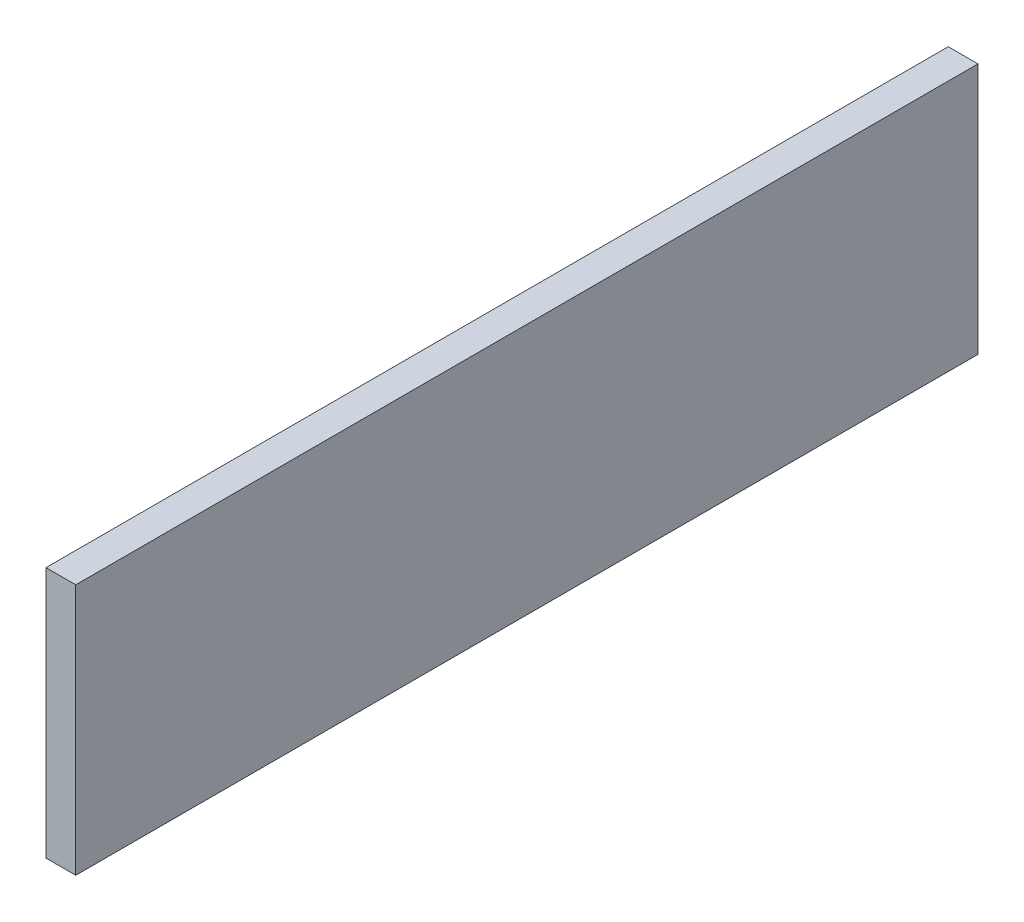
ISO-10303-21;
HEADER;
FILE_DESCRIPTION(('STEP AP214'),'2;1');
FILE_NAME('part.step','',(''),(''),'','','');
FILE_SCHEMA(('AUTOMOTIVE_DESIGN { 1 0 10303 214 1 1 1 1 }'));
ENDSEC;
DATA;
#1=APPLICATION_CONTEXT('core data for automotive mechanical design processes');
#2=APPLICATION_PROTOCOL_DEFINITION('international standard','automotive_design',2000,#1);
#3=PRODUCT_CONTEXT('',#1,'mechanical');
#4=PRODUCT('Part','Part','',(#3));
#5=PRODUCT_RELATED_PRODUCT_CATEGORY('part','',(#4));
#6=PRODUCT_DEFINITION_FORMATION('','',#4);
#7=PRODUCT_DEFINITION_CONTEXT('part definition',#1,'design');
#8=PRODUCT_DEFINITION('design','',#6,#7);
#9=PRODUCT_DEFINITION_SHAPE('','',#8);
#10=(LENGTH_UNIT() NAMED_UNIT(*) SI_UNIT(.MILLI.,.METRE.));
#11=(NAMED_UNIT(*) PLANE_ANGLE_UNIT() SI_UNIT($,.RADIAN.));
#12=(NAMED_UNIT(*) SI_UNIT($,.STERADIAN.) SOLID_ANGLE_UNIT());
#13=UNCERTAINTY_MEASURE_WITH_UNIT(LENGTH_MEASURE(1.E-05),#10,'distance_accuracy_value','');
#14=(GEOMETRIC_REPRESENTATION_CONTEXT(3) GLOBAL_UNCERTAINTY_ASSIGNED_CONTEXT((#13)) GLOBAL_UNIT_ASSIGNED_CONTEXT((#10,
#11,#12)) REPRESENTATION_CONTEXT('',''));
#15=CARTESIAN_POINT('',(0.,0.,0.));
#16=DIRECTION('',(0.,0.,1.));
#17=DIRECTION('',(1.,0.,0.));
#18=AXIS2_PLACEMENT_3D('',#15,#16,#17);
#19=CARTESIAN_POINT('',(0.,644.525,0.));
#20=DIRECTION('',(1.,0.,0.));
#21=DIRECTION('',(0.,0.,-1.));
#22=AXIS2_PLACEMENT_3D('',#19,#20,#21);
#23=PLANE('',#22);
#24=DIRECTION('',(0.,0.,1.));
#25=VECTOR('',#24,1.);
#26=CARTESIAN_POINT('',(0.,0.,0.));
#27=LINE('',#26,#25);
#28=CARTESIAN_POINT('',(0.,0.,-2311.4));
#29=VERTEX_POINT('',#28);
#30=CARTESIAN_POINT('',(0.,0.,0.));
#31=VERTEX_POINT('',#30);
#32=EDGE_CURVE('E97',#29,#31,#27,.T.);
#33=ORIENTED_EDGE('',*,*,#32,.T.);
#34=DIRECTION('',(0.,-1.,0.));
#35=VECTOR('',#34,1.);
#36=CARTESIAN_POINT('',(0.,644.525,0.));
#37=LINE('',#36,#35);
#38=CARTESIAN_POINT('',(0.,644.525,0.));
#39=VERTEX_POINT('',#38);
#40=EDGE_CURVE('E11',#39,#31,#37,.T.);
#41=ORIENTED_EDGE('',*,*,#40,.F.);
#42=DIRECTION('',(0.,0.,1.));
#43=VECTOR('',#42,1.);
#44=CARTESIAN_POINT('',(0.,644.525,0.));
#45=LINE('',#44,#43);
#46=CARTESIAN_POINT('',(0.,644.525,-2311.4));
#47=VERTEX_POINT('',#46);
#48=EDGE_CURVE('E85',#47,#39,#45,.T.);
#49=ORIENTED_EDGE('',*,*,#48,.F.);
#50=DIRECTION('',(0.,-1.,0.));
#51=VECTOR('',#50,1.);
#52=CARTESIAN_POINT('',(0.,644.525,-2311.4));
#53=LINE('',#52,#51);
#54=EDGE_CURVE('E93',#47,#29,#53,.T.);
#55=ORIENTED_EDGE('',*,*,#54,.T.);
#56=EDGE_LOOP('',(#33,#41,#49,#55));
#57=FACE_BOUND('',#56,.T.);
#58=ADVANCED_FACE('F34',(#57),#23,.F.);
#59=CARTESIAN_POINT('',(0.,644.525,0.));
#60=DIRECTION('',(0.,0.,-1.));
#61=DIRECTION('',(-1.,0.,0.));
#62=AXIS2_PLACEMENT_3D('',#59,#60,#61);
#63=PLANE('',#62);
#64=DIRECTION('',(1.,0.,0.));
#65=VECTOR('',#64,1.);
#66=CARTESIAN_POINT('',(0.,0.,0.));
#67=LINE('',#66,#65);
#68=CARTESIAN_POINT('',(76.2,0.,0.));
#69=VERTEX_POINT('',#68);
#70=EDGE_CURVE('E89',#31,#69,#67,.T.);
#71=ORIENTED_EDGE('',*,*,#70,.T.);
#72=DIRECTION('',(0.,-1.,0.));
#73=VECTOR('',#72,1.);
#74=CARTESIAN_POINT('',(76.2,644.525,0.));
#75=LINE('',#74,#73);
#76=CARTESIAN_POINT('',(76.2,644.525,0.));
#77=VERTEX_POINT('',#76);
#78=EDGE_CURVE('E42',#77,#69,#75,.T.);
#79=ORIENTED_EDGE('',*,*,#78,.F.);
#80=DIRECTION('',(1.,0.,0.));
#81=VECTOR('',#80,1.);
#82=CARTESIAN_POINT('',(0.,644.525,0.));
#83=LINE('',#82,#81);
#84=EDGE_CURVE('E80',#39,#77,#83,.T.);
#85=ORIENTED_EDGE('',*,*,#84,.F.);
#86=ORIENTED_EDGE('',*,*,#40,.T.);
#87=EDGE_LOOP('',(#71,#79,#85,#86));
#88=FACE_BOUND('',#87,.T.);
#89=ADVANCED_FACE('F88',(#88),#63,.F.);
#90=CARTESIAN_POINT('',(76.2,644.525,0.));
#91=DIRECTION('',(-1.,0.,0.));
#92=DIRECTION('',(0.,0.,1.));
#93=AXIS2_PLACEMENT_3D('',#90,#91,#92);
#94=PLANE('',#93);
#95=DIRECTION('',(0.,0.,-1.));
#96=VECTOR('',#95,1.);
#97=CARTESIAN_POINT('',(76.2,0.,0.));
#98=LINE('',#97,#96);
#99=CARTESIAN_POINT('',(76.2,0.,-2311.4));
#100=VERTEX_POINT('',#99);
#101=EDGE_CURVE('E67',#69,#100,#98,.T.);
#102=ORIENTED_EDGE('',*,*,#101,.T.);
#103=DIRECTION('',(0.,-1.,0.));
#104=VECTOR('',#103,1.);
#105=CARTESIAN_POINT('',(76.2,644.525,-2311.4));
#106=LINE('',#105,#104);
#107=CARTESIAN_POINT('',(76.2,644.525,-2311.4));
#108=VERTEX_POINT('',#107);
#109=EDGE_CURVE('E90',#108,#100,#106,.T.);
#110=ORIENTED_EDGE('',*,*,#109,.F.);
#111=DIRECTION('',(0.,0.,-1.));
#112=VECTOR('',#111,1.);
#113=CARTESIAN_POINT('',(76.2,644.525,0.));
#114=LINE('',#113,#112);
#115=EDGE_CURVE('E83',#77,#108,#114,.T.);
#116=ORIENTED_EDGE('',*,*,#115,.F.);
#117=ORIENTED_EDGE('',*,*,#78,.T.);
#118=EDGE_LOOP('',(#102,#110,#116,#117));
#119=FACE_BOUND('',#118,.T.);
#120=ADVANCED_FACE('F91',(#119),#94,.F.);
#121=CARTESIAN_POINT('',(0.,644.525,-2311.4));
#122=DIRECTION('',(0.,0.,1.));
#123=DIRECTION('',(1.,0.,0.));
#124=AXIS2_PLACEMENT_3D('',#121,#122,#123);
#125=PLANE('',#124);
#126=DIRECTION('',(-1.,0.,0.));
#127=VECTOR('',#126,1.);
#128=CARTESIAN_POINT('',(0.,0.,-2311.4));
#129=LINE('',#128,#127);
#130=EDGE_CURVE('E73',#100,#29,#129,.T.);
#131=ORIENTED_EDGE('',*,*,#130,.T.);
#132=ORIENTED_EDGE('',*,*,#54,.F.);
#133=DIRECTION('',(-1.,0.,0.));
#134=VECTOR('',#133,1.);
#135=CARTESIAN_POINT('',(0.,644.525,-2311.4));
#136=LINE('',#135,#134);
#137=EDGE_CURVE('E50',#108,#47,#136,.T.);
#138=ORIENTED_EDGE('',*,*,#137,.F.);
#139=ORIENTED_EDGE('',*,*,#109,.T.);
#140=EDGE_LOOP('',(#131,#132,#138,#139));
#141=FACE_BOUND('',#140,.T.);
#142=ADVANCED_FACE('F104',(#141),#125,.F.);
#143=CARTESIAN_POINT('',(0.,644.525,0.));
#144=DIRECTION('',(0.,-1.,0.));
#145=DIRECTION('',(0.,0.,-1.));
#146=AXIS2_PLACEMENT_3D('',#143,#144,#145);
#147=PLANE('',#146);
#148=ORIENTED_EDGE('',*,*,#48,.T.);
#149=ORIENTED_EDGE('',*,*,#84,.T.);
#150=ORIENTED_EDGE('',*,*,#115,.T.);
#151=ORIENTED_EDGE('',*,*,#137,.T.);
#152=EDGE_LOOP('',(#148,#149,#150,#151));
#153=FACE_BOUND('',#152,.T.);
#154=ADVANCED_FACE('F81',(#153),#147,.F.);
#155=CARTESIAN_POINT('',(0.,0.,0.));
#156=DIRECTION('',(0.,-1.,0.));
#157=DIRECTION('',(0.,0.,-1.));
#158=AXIS2_PLACEMENT_3D('',#155,#156,#157);
#159=PLANE('',#158);
#160=ORIENTED_EDGE('',*,*,#32,.F.);
#161=ORIENTED_EDGE('',*,*,#130,.F.);
#162=ORIENTED_EDGE('',*,*,#101,.F.);
#163=ORIENTED_EDGE('',*,*,#70,.F.);
#164=EDGE_LOOP('',(#160,#161,#162,#163));
#165=FACE_BOUND('',#164,.T.);
#166=ADVANCED_FACE('F107',(#165),#159,.T.);
#167=CLOSED_SHELL('',(#58,#89,#120,#142,#154,#166));
#168=MANIFOLD_SOLID_BREP('B2',#167);
#169=ADVANCED_BREP_SHAPE_REPRESENTATION('',(#18,#168),#14);
#170=SHAPE_DEFINITION_REPRESENTATION(#9,#169);
ENDSEC;
END-ISO-10303-21;
